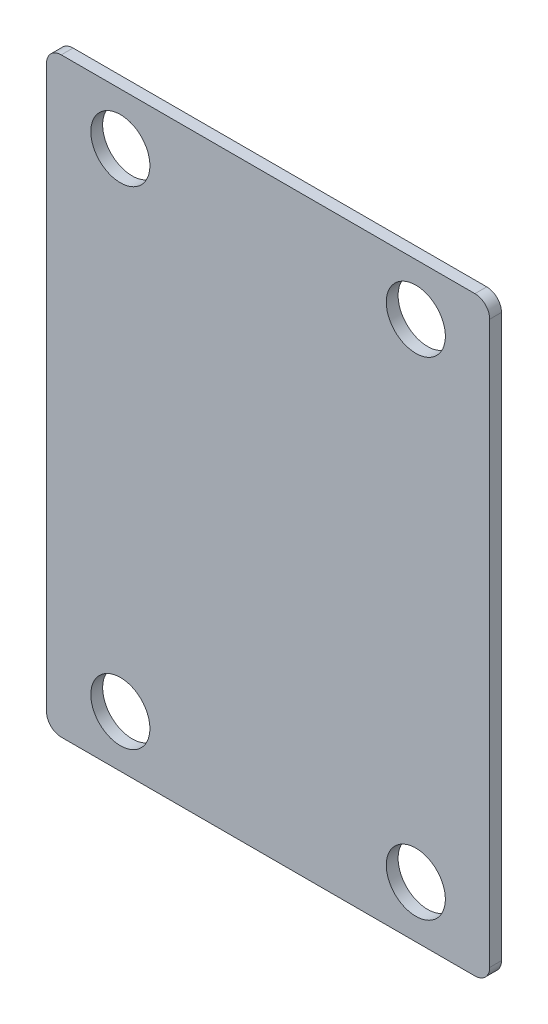
ISO-10303-21;
HEADER;
FILE_DESCRIPTION(('STEP AP214'),'2;1');
FILE_NAME('part.step','',(''),(''),'','','');
FILE_SCHEMA(('AUTOMOTIVE_DESIGN { 1 0 10303 214 1 1 1 1 }'));
ENDSEC;
DATA;
#1=APPLICATION_CONTEXT('core data for automotive mechanical design processes');
#2=APPLICATION_PROTOCOL_DEFINITION('international standard','automotive_design',2000,#1);
#3=PRODUCT_CONTEXT('',#1,'mechanical');
#4=PRODUCT('Part','Part','',(#3));
#5=PRODUCT_RELATED_PRODUCT_CATEGORY('part','',(#4));
#6=PRODUCT_DEFINITION_FORMATION('','',#4);
#7=PRODUCT_DEFINITION_CONTEXT('part definition',#1,'design');
#8=PRODUCT_DEFINITION('design','',#6,#7);
#9=PRODUCT_DEFINITION_SHAPE('','',#8);
#10=(LENGTH_UNIT() NAMED_UNIT(*) SI_UNIT(.MILLI.,.METRE.));
#11=(NAMED_UNIT(*) PLANE_ANGLE_UNIT() SI_UNIT($,.RADIAN.));
#12=(NAMED_UNIT(*) SI_UNIT($,.STERADIAN.) SOLID_ANGLE_UNIT());
#13=UNCERTAINTY_MEASURE_WITH_UNIT(LENGTH_MEASURE(1.E-05),#10,'distance_accuracy_value','');
#14=(GEOMETRIC_REPRESENTATION_CONTEXT(3) GLOBAL_UNCERTAINTY_ASSIGNED_CONTEXT((#13)) GLOBAL_UNIT_ASSIGNED_CONTEXT((#10,
#11,#12)) REPRESENTATION_CONTEXT('',''));
#15=CARTESIAN_POINT('',(0.,0.,0.));
#16=DIRECTION('',(0.,0.,1.));
#17=DIRECTION('',(1.,0.,0.));
#18=AXIS2_PLACEMENT_3D('',#15,#16,#17);
#19=CARTESIAN_POINT('',(0.,0.,1.6));
#20=DIRECTION('',(0.,0.,-1.));
#21=DIRECTION('',(-1.,0.,0.));
#22=AXIS2_PLACEMENT_3D('',#19,#20,#21);
#23=PLANE('',#22);
#24=DIRECTION('',(0.,-1.,0.));
#25=VECTOR('',#24,1.);
#26=CARTESIAN_POINT('',(-30.,-40.,1.6));
#27=LINE('',#26,#25);
#28=CARTESIAN_POINT('',(-30.,38.,1.6));
#29=VERTEX_POINT('',#28);
#30=CARTESIAN_POINT('',(-30.,-38.,1.6));
#31=VERTEX_POINT('',#30);
#32=EDGE_CURVE('E172',#29,#31,#27,.T.);
#33=ORIENTED_EDGE('',*,*,#32,.T.);
#34=CARTESIAN_POINT('',(-28.,-38.,1.6));
#35=DIRECTION('',(0.,0.,-1.));
#36=DIRECTION('',(-1.,0.,0.));
#37=AXIS2_PLACEMENT_3D('',#34,#35,#36);
#38=CIRCLE('',#37,2.);
#39=CARTESIAN_POINT('',(-28.,-40.,1.6));
#40=VERTEX_POINT('',#39);
#41=EDGE_CURVE('E149',#31,#40,#38,.F.);
#42=ORIENTED_EDGE('',*,*,#41,.T.);
#43=DIRECTION('',(1.,0.,0.));
#44=VECTOR('',#43,1.);
#45=CARTESIAN_POINT('',(-30.,-40.,1.6));
#46=LINE('',#45,#44);
#47=CARTESIAN_POINT('',(28.,-40.,1.6));
#48=VERTEX_POINT('',#47);
#49=EDGE_CURVE('E120',#40,#48,#46,.T.);
#50=ORIENTED_EDGE('',*,*,#49,.T.);
#51=CARTESIAN_POINT('',(28.,-38.,1.6));
#52=DIRECTION('',(0.,0.,-1.));
#53=DIRECTION('',(-1.,0.,0.));
#54=AXIS2_PLACEMENT_3D('',#51,#52,#53);
#55=CIRCLE('',#54,2.);
#56=CARTESIAN_POINT('',(30.,-38.,1.6));
#57=VERTEX_POINT('',#56);
#58=EDGE_CURVE('E145',#48,#57,#55,.F.);
#59=ORIENTED_EDGE('',*,*,#58,.T.);
#60=DIRECTION('',(0.,1.,0.));
#61=VECTOR('',#60,1.);
#62=CARTESIAN_POINT('',(30.,-40.,1.6));
#63=LINE('',#62,#61);
#64=CARTESIAN_POINT('',(30.,38.,1.6));
#65=VERTEX_POINT('',#64);
#66=EDGE_CURVE('E128',#57,#65,#63,.T.);
#67=ORIENTED_EDGE('',*,*,#66,.T.);
#68=CARTESIAN_POINT('',(28.,38.,1.6));
#69=DIRECTION('',(0.,0.,-1.));
#70=DIRECTION('',(-1.,0.,0.));
#71=AXIS2_PLACEMENT_3D('',#68,#69,#70);
#72=CIRCLE('',#71,2.);
#73=CARTESIAN_POINT('',(28.,40.,1.6));
#74=VERTEX_POINT('',#73);
#75=EDGE_CURVE('E55',#65,#74,#72,.F.);
#76=ORIENTED_EDGE('',*,*,#75,.T.);
#77=DIRECTION('',(-1.,0.,0.));
#78=VECTOR('',#77,1.);
#79=CARTESIAN_POINT('',(-30.,40.,1.6));
#80=LINE('',#79,#78);
#81=CARTESIAN_POINT('',(-28.,40.,1.6));
#82=VERTEX_POINT('',#81);
#83=EDGE_CURVE('E131',#74,#82,#80,.T.);
#84=ORIENTED_EDGE('',*,*,#83,.T.);
#85=CARTESIAN_POINT('',(-28.,38.,1.6));
#86=DIRECTION('',(0.,0.,-1.));
#87=DIRECTION('',(-1.,0.,0.));
#88=AXIS2_PLACEMENT_3D('',#85,#86,#87);
#89=CIRCLE('',#88,2.);
#90=EDGE_CURVE('E147',#82,#29,#89,.F.);
#91=ORIENTED_EDGE('',*,*,#90,.T.);
#92=EDGE_LOOP('',(#33,#42,#50,#59,#67,#76,#84,#91));
#93=FACE_BOUND('',#92,.T.);
#94=CARTESIAN_POINT('',(-20.,33.,1.6));
#95=DIRECTION('',(0.,0.,1.));
#96=DIRECTION('',(1.,0.,0.));
#97=AXIS2_PLACEMENT_3D('',#94,#95,#96);
#98=CIRCLE('',#97,4.);
#99=CARTESIAN_POINT('',(-16.,33.,1.6));
#100=VERTEX_POINT('',#99);
#101=EDGE_CURVE('E168',#100,#100,#98,.T.);
#102=ORIENTED_EDGE('',*,*,#101,.F.);
#103=EDGE_LOOP('',(#102));
#104=FACE_BOUND('',#103,.T.);
#105=CARTESIAN_POINT('',(20.,33.,1.6));
#106=DIRECTION('',(0.,0.,1.));
#107=DIRECTION('',(-1.,0.,0.));
#108=AXIS2_PLACEMENT_3D('',#105,#106,#107);
#109=CIRCLE('',#108,4.);
#110=CARTESIAN_POINT('',(16.,33.,1.6));
#111=VERTEX_POINT('',#110);
#112=EDGE_CURVE('E178',#111,#111,#109,.T.);
#113=ORIENTED_EDGE('',*,*,#112,.F.);
#114=EDGE_LOOP('',(#113));
#115=FACE_BOUND('',#114,.T.);
#116=CARTESIAN_POINT('',(20.,-33.,1.6));
#117=DIRECTION('',(0.,0.,1.));
#118=DIRECTION('',(1.,0.,0.));
#119=AXIS2_PLACEMENT_3D('',#116,#117,#118);
#120=CIRCLE('',#119,4.);
#121=CARTESIAN_POINT('',(24.,-33.,1.6));
#122=VERTEX_POINT('',#121);
#123=EDGE_CURVE('E184',#122,#122,#120,.T.);
#124=ORIENTED_EDGE('',*,*,#123,.F.);
#125=EDGE_LOOP('',(#124));
#126=FACE_BOUND('',#125,.T.);
#127=CARTESIAN_POINT('',(-20.,-33.,1.6));
#128=DIRECTION('',(0.,0.,1.));
#129=DIRECTION('',(-1.,0.,0.));
#130=AXIS2_PLACEMENT_3D('',#127,#128,#129);
#131=CIRCLE('',#130,4.);
#132=CARTESIAN_POINT('',(-24.,-33.,1.6));
#133=VERTEX_POINT('',#132);
#134=EDGE_CURVE('E190',#133,#133,#131,.T.);
#135=ORIENTED_EDGE('',*,*,#134,.F.);
#136=EDGE_LOOP('',(#135));
#137=FACE_BOUND('',#136,.T.);
#138=ADVANCED_FACE('F33',(#93,#104,#115,#126,#137),#23,.F.);
#139=CARTESIAN_POINT('',(0.,0.,0.));
#140=DIRECTION('',(0.,0.,-1.));
#141=DIRECTION('',(-1.,0.,0.));
#142=AXIS2_PLACEMENT_3D('',#139,#140,#141);
#143=PLANE('',#142);
#144=CARTESIAN_POINT('',(20.,-33.,0.));
#145=DIRECTION('',(0.,0.,1.));
#146=DIRECTION('',(1.,0.,0.));
#147=AXIS2_PLACEMENT_3D('',#144,#145,#146);
#148=CIRCLE('',#147,4.);
#149=CARTESIAN_POINT('',(24.,-33.,0.));
#150=VERTEX_POINT('',#149);
#151=EDGE_CURVE('E187',#150,#150,#148,.T.);
#152=ORIENTED_EDGE('',*,*,#151,.T.);
#153=EDGE_LOOP('',(#152));
#154=FACE_BOUND('',#153,.T.);
#155=CARTESIAN_POINT('',(-20.,33.,0.));
#156=DIRECTION('',(0.,0.,1.));
#157=DIRECTION('',(1.,0.,0.));
#158=AXIS2_PLACEMENT_3D('',#155,#156,#157);
#159=CIRCLE('',#158,4.);
#160=CARTESIAN_POINT('',(-16.,33.,0.));
#161=VERTEX_POINT('',#160);
#162=EDGE_CURVE('E175',#161,#161,#159,.T.);
#163=ORIENTED_EDGE('',*,*,#162,.T.);
#164=EDGE_LOOP('',(#163));
#165=FACE_BOUND('',#164,.T.);
#166=DIRECTION('',(1.,0.,0.));
#167=VECTOR('',#166,1.);
#168=CARTESIAN_POINT('',(-30.,-40.,0.));
#169=LINE('',#168,#167);
#170=CARTESIAN_POINT('',(-28.,-40.,0.));
#171=VERTEX_POINT('',#170);
#172=CARTESIAN_POINT('',(28.,-40.,0.));
#173=VERTEX_POINT('',#172);
#174=EDGE_CURVE('E117',#171,#173,#169,.T.);
#175=ORIENTED_EDGE('',*,*,#174,.F.);
#176=CARTESIAN_POINT('',(-28.,-38.,0.));
#177=DIRECTION('',(0.,0.,-1.));
#178=DIRECTION('',(-1.,0.,0.));
#179=AXIS2_PLACEMENT_3D('',#176,#177,#178);
#180=CIRCLE('',#179,2.);
#181=CARTESIAN_POINT('',(-30.,-38.,0.));
#182=VERTEX_POINT('',#181);
#183=EDGE_CURVE('E100',#171,#182,#180,.T.);
#184=ORIENTED_EDGE('',*,*,#183,.T.);
#185=DIRECTION('',(0.,-1.,0.));
#186=VECTOR('',#185,1.);
#187=CARTESIAN_POINT('',(-30.,-40.,0.));
#188=LINE('',#187,#186);
#189=CARTESIAN_POINT('',(-30.,38.,0.));
#190=VERTEX_POINT('',#189);
#191=EDGE_CURVE('E129',#190,#182,#188,.T.);
#192=ORIENTED_EDGE('',*,*,#191,.F.);
#193=CARTESIAN_POINT('',(-28.,38.,0.));
#194=DIRECTION('',(0.,0.,-1.));
#195=DIRECTION('',(-1.,0.,0.));
#196=AXIS2_PLACEMENT_3D('',#193,#194,#195);
#197=CIRCLE('',#196,2.);
#198=CARTESIAN_POINT('',(-28.,40.,0.));
#199=VERTEX_POINT('',#198);
#200=EDGE_CURVE('E111',#190,#199,#197,.T.);
#201=ORIENTED_EDGE('',*,*,#200,.T.);
#202=DIRECTION('',(-1.,0.,0.));
#203=VECTOR('',#202,1.);
#204=CARTESIAN_POINT('',(-30.,40.,0.));
#205=LINE('',#204,#203);
#206=CARTESIAN_POINT('',(28.,40.,0.));
#207=VERTEX_POINT('',#206);
#208=EDGE_CURVE('E133',#207,#199,#205,.T.);
#209=ORIENTED_EDGE('',*,*,#208,.F.);
#210=CARTESIAN_POINT('',(28.,38.,0.));
#211=DIRECTION('',(0.,0.,-1.));
#212=DIRECTION('',(-1.,0.,0.));
#213=AXIS2_PLACEMENT_3D('',#210,#211,#212);
#214=CIRCLE('',#213,2.);
#215=CARTESIAN_POINT('',(30.,38.,0.));
#216=VERTEX_POINT('',#215);
#217=EDGE_CURVE('E121',#207,#216,#214,.T.);
#218=ORIENTED_EDGE('',*,*,#217,.T.);
#219=DIRECTION('',(0.,1.,0.));
#220=VECTOR('',#219,1.);
#221=CARTESIAN_POINT('',(30.,-40.,0.));
#222=LINE('',#221,#220);
#223=CARTESIAN_POINT('',(30.,-38.,0.));
#224=VERTEX_POINT('',#223);
#225=EDGE_CURVE('E160',#224,#216,#222,.T.);
#226=ORIENTED_EDGE('',*,*,#225,.F.);
#227=CARTESIAN_POINT('',(28.,-38.,0.));
#228=DIRECTION('',(0.,0.,-1.));
#229=DIRECTION('',(-1.,0.,0.));
#230=AXIS2_PLACEMENT_3D('',#227,#228,#229);
#231=CIRCLE('',#230,2.);
#232=EDGE_CURVE('E127',#224,#173,#231,.T.);
#233=ORIENTED_EDGE('',*,*,#232,.T.);
#234=EDGE_LOOP('',(#175,#184,#192,#201,#209,#218,#226,#233));
#235=FACE_BOUND('',#234,.T.);
#236=CARTESIAN_POINT('',(20.,33.,0.));
#237=DIRECTION('',(0.,0.,1.));
#238=DIRECTION('',(-1.,0.,0.));
#239=AXIS2_PLACEMENT_3D('',#236,#237,#238);
#240=CIRCLE('',#239,4.);
#241=CARTESIAN_POINT('',(16.,33.,0.));
#242=VERTEX_POINT('',#241);
#243=EDGE_CURVE('E181',#242,#242,#240,.T.);
#244=ORIENTED_EDGE('',*,*,#243,.T.);
#245=EDGE_LOOP('',(#244));
#246=FACE_BOUND('',#245,.T.);
#247=CARTESIAN_POINT('',(-20.,-33.,0.));
#248=DIRECTION('',(0.,0.,1.));
#249=DIRECTION('',(-1.,0.,0.));
#250=AXIS2_PLACEMENT_3D('',#247,#248,#249);
#251=CIRCLE('',#250,4.);
#252=CARTESIAN_POINT('',(-24.,-33.,0.));
#253=VERTEX_POINT('',#252);
#254=EDGE_CURVE('E193',#253,#253,#251,.T.);
#255=ORIENTED_EDGE('',*,*,#254,.T.);
#256=EDGE_LOOP('',(#255));
#257=FACE_BOUND('',#256,.T.);
#258=ADVANCED_FACE('F124',(#154,#165,#235,#246,#257),#143,.T.);
#259=CARTESIAN_POINT('',(30.,-40.,1.6));
#260=DIRECTION('',(-1.,0.,0.));
#261=DIRECTION('',(0.,-1.,0.));
#262=AXIS2_PLACEMENT_3D('',#259,#260,#261);
#263=PLANE('',#262);
#264=ORIENTED_EDGE('',*,*,#66,.F.);
#265=DIRECTION('',(0.,0.,-1.));
#266=VECTOR('',#265,1.);
#267=CARTESIAN_POINT('',(30.,-38.,1.6));
#268=LINE('',#267,#266);
#269=EDGE_CURVE('E11',#57,#224,#268,.T.);
#270=ORIENTED_EDGE('',*,*,#269,.T.);
#271=ORIENTED_EDGE('',*,*,#225,.T.);
#272=DIRECTION('',(0.,0.,-1.));
#273=VECTOR('',#272,1.);
#274=CARTESIAN_POINT('',(30.,38.,1.6));
#275=LINE('',#274,#273);
#276=EDGE_CURVE('E41',#216,#65,#275,.F.);
#277=ORIENTED_EDGE('',*,*,#276,.T.);
#278=EDGE_LOOP('',(#264,#270,#271,#277));
#279=FACE_BOUND('',#278,.T.);
#280=ADVANCED_FACE('F158',(#279),#263,.F.);
#281=CARTESIAN_POINT('',(-30.,40.,1.6));
#282=DIRECTION('',(0.,-1.,0.));
#283=DIRECTION('',(1.,0.,0.));
#284=AXIS2_PLACEMENT_3D('',#281,#282,#283);
#285=PLANE('',#284);
#286=ORIENTED_EDGE('',*,*,#208,.T.);
#287=DIRECTION('',(0.,0.,-1.));
#288=VECTOR('',#287,1.);
#289=CARTESIAN_POINT('',(-28.,40.,1.6));
#290=LINE('',#289,#288);
#291=EDGE_CURVE('E48',#199,#82,#290,.F.);
#292=ORIENTED_EDGE('',*,*,#291,.T.);
#293=ORIENTED_EDGE('',*,*,#83,.F.);
#294=DIRECTION('',(0.,0.,-1.));
#295=VECTOR('',#294,1.);
#296=CARTESIAN_POINT('',(28.,40.,1.6));
#297=LINE('',#296,#295);
#298=EDGE_CURVE('E151',#74,#207,#297,.T.);
#299=ORIENTED_EDGE('',*,*,#298,.T.);
#300=EDGE_LOOP('',(#286,#292,#293,#299));
#301=FACE_BOUND('',#300,.T.);
#302=ADVANCED_FACE('F167',(#301),#285,.F.);
#303=CARTESIAN_POINT('',(-30.,-40.,1.6));
#304=DIRECTION('',(1.,0.,0.));
#305=DIRECTION('',(0.,1.,0.));
#306=AXIS2_PLACEMENT_3D('',#303,#304,#305);
#307=PLANE('',#306);
#308=ORIENTED_EDGE('',*,*,#191,.T.);
#309=DIRECTION('',(0.,0.,-1.));
#310=VECTOR('',#309,1.);
#311=CARTESIAN_POINT('',(-30.,-38.,1.6));
#312=LINE('',#311,#310);
#313=EDGE_CURVE('E105',#182,#31,#312,.F.);
#314=ORIENTED_EDGE('',*,*,#313,.T.);
#315=ORIENTED_EDGE('',*,*,#32,.F.);
#316=DIRECTION('',(0.,0.,-1.));
#317=VECTOR('',#316,1.);
#318=CARTESIAN_POINT('',(-30.,38.,1.6));
#319=LINE('',#318,#317);
#320=EDGE_CURVE('E110',#29,#190,#319,.T.);
#321=ORIENTED_EDGE('',*,*,#320,.T.);
#322=EDGE_LOOP('',(#308,#314,#315,#321));
#323=FACE_BOUND('',#322,.T.);
#324=ADVANCED_FACE('F215',(#323),#307,.F.);
#325=CARTESIAN_POINT('',(-30.,-40.,1.6));
#326=DIRECTION('',(0.,1.,0.));
#327=DIRECTION('',(-1.,0.,0.));
#328=AXIS2_PLACEMENT_3D('',#325,#326,#327);
#329=PLANE('',#328);
#330=ORIENTED_EDGE('',*,*,#49,.F.);
#331=DIRECTION('',(0.,0.,-1.));
#332=VECTOR('',#331,1.);
#333=CARTESIAN_POINT('',(-28.,-40.,1.6));
#334=LINE('',#333,#332);
#335=EDGE_CURVE('E104',#40,#171,#334,.T.);
#336=ORIENTED_EDGE('',*,*,#335,.T.);
#337=ORIENTED_EDGE('',*,*,#174,.T.);
#338=DIRECTION('',(0.,0.,-1.));
#339=VECTOR('',#338,1.);
#340=CARTESIAN_POINT('',(28.,-40.,1.6));
#341=LINE('',#340,#339);
#342=EDGE_CURVE('E122',#173,#48,#341,.F.);
#343=ORIENTED_EDGE('',*,*,#342,.T.);
#344=EDGE_LOOP('',(#330,#336,#337,#343));
#345=FACE_BOUND('',#344,.T.);
#346=ADVANCED_FACE('F116',(#345),#329,.F.);
#347=CARTESIAN_POINT('',(-20.,33.,1.6));
#348=DIRECTION('',(0.,0.,-1.));
#349=DIRECTION('',(-1.,0.,0.));
#350=AXIS2_PLACEMENT_3D('',#347,#348,#349);
#351=CYLINDRICAL_SURFACE('',#350,4.);
#352=ORIENTED_EDGE('',*,*,#101,.T.);
#353=EDGE_LOOP('',(#352));
#354=FACE_BOUND('',#353,.T.);
#355=ORIENTED_EDGE('',*,*,#162,.F.);
#356=EDGE_LOOP('',(#355));
#357=FACE_BOUND('',#356,.T.);
#358=ADVANCED_FACE('F210',(#354,#357),#351,.F.);
#359=CARTESIAN_POINT('',(20.,33.,1.6));
#360=DIRECTION('',(0.,0.,-1.));
#361=DIRECTION('',(-1.,0.,0.));
#362=AXIS2_PLACEMENT_3D('',#359,#360,#361);
#363=CYLINDRICAL_SURFACE('',#362,4.);
#364=ORIENTED_EDGE('',*,*,#112,.T.);
#365=EDGE_LOOP('',(#364));
#366=FACE_BOUND('',#365,.T.);
#367=ORIENTED_EDGE('',*,*,#243,.F.);
#368=EDGE_LOOP('',(#367));
#369=FACE_BOUND('',#368,.T.);
#370=ADVANCED_FACE('F309',(#366,#369),#363,.F.);
#371=CARTESIAN_POINT('',(20.,-33.,1.6));
#372=DIRECTION('',(0.,0.,-1.));
#373=DIRECTION('',(-1.,0.,0.));
#374=AXIS2_PLACEMENT_3D('',#371,#372,#373);
#375=CYLINDRICAL_SURFACE('',#374,4.);
#376=ORIENTED_EDGE('',*,*,#123,.T.);
#377=EDGE_LOOP('',(#376));
#378=FACE_BOUND('',#377,.T.);
#379=ORIENTED_EDGE('',*,*,#151,.F.);
#380=EDGE_LOOP('',(#379));
#381=FACE_BOUND('',#380,.T.);
#382=ADVANCED_FACE('F300',(#378,#381),#375,.F.);
#383=CARTESIAN_POINT('',(-20.,-33.,1.6));
#384=DIRECTION('',(0.,0.,-1.));
#385=DIRECTION('',(-1.,0.,0.));
#386=AXIS2_PLACEMENT_3D('',#383,#384,#385);
#387=CYLINDRICAL_SURFACE('',#386,4.);
#388=ORIENTED_EDGE('',*,*,#134,.T.);
#389=EDGE_LOOP('',(#388));
#390=FACE_BOUND('',#389,.T.);
#391=ORIENTED_EDGE('',*,*,#254,.F.);
#392=EDGE_LOOP('',(#391));
#393=FACE_BOUND('',#392,.T.);
#394=ADVANCED_FACE('F199',(#390,#393),#387,.F.);
#395=CARTESIAN_POINT('',(-28.,-38.,1.6));
#396=DIRECTION('',(0.,0.,-1.));
#397=DIRECTION('',(-1.,0.,0.));
#398=AXIS2_PLACEMENT_3D('',#395,#396,#397);
#399=CYLINDRICAL_SURFACE('',#398,2.);
#400=ORIENTED_EDGE('',*,*,#41,.F.);
#401=ORIENTED_EDGE('',*,*,#313,.F.);
#402=ORIENTED_EDGE('',*,*,#183,.F.);
#403=ORIENTED_EDGE('',*,*,#335,.F.);
#404=EDGE_LOOP('',(#400,#401,#402,#403));
#405=FACE_BOUND('',#404,.T.);
#406=ADVANCED_FACE('F103',(#405),#399,.T.);
#407=CARTESIAN_POINT('',(-28.,38.,1.6));
#408=DIRECTION('',(0.,0.,-1.));
#409=DIRECTION('',(-1.,0.,0.));
#410=AXIS2_PLACEMENT_3D('',#407,#408,#409);
#411=CYLINDRICAL_SURFACE('',#410,2.);
#412=ORIENTED_EDGE('',*,*,#90,.F.);
#413=ORIENTED_EDGE('',*,*,#291,.F.);
#414=ORIENTED_EDGE('',*,*,#200,.F.);
#415=ORIENTED_EDGE('',*,*,#320,.F.);
#416=EDGE_LOOP('',(#412,#413,#414,#415));
#417=FACE_BOUND('',#416,.T.);
#418=ADVANCED_FACE('F225',(#417),#411,.T.);
#419=CARTESIAN_POINT('',(28.,-38.,1.6));
#420=DIRECTION('',(0.,0.,-1.));
#421=DIRECTION('',(-1.,0.,0.));
#422=AXIS2_PLACEMENT_3D('',#419,#420,#421);
#423=CYLINDRICAL_SURFACE('',#422,2.);
#424=ORIENTED_EDGE('',*,*,#58,.F.);
#425=ORIENTED_EDGE('',*,*,#342,.F.);
#426=ORIENTED_EDGE('',*,*,#232,.F.);
#427=ORIENTED_EDGE('',*,*,#269,.F.);
#428=EDGE_LOOP('',(#424,#425,#426,#427));
#429=FACE_BOUND('',#428,.T.);
#430=ADVANCED_FACE('F227',(#429),#423,.T.);
#431=CARTESIAN_POINT('',(28.,38.,1.6));
#432=DIRECTION('',(0.,0.,-1.));
#433=DIRECTION('',(-1.,0.,0.));
#434=AXIS2_PLACEMENT_3D('',#431,#432,#433);
#435=CYLINDRICAL_SURFACE('',#434,2.);
#436=ORIENTED_EDGE('',*,*,#75,.F.);
#437=ORIENTED_EDGE('',*,*,#276,.F.);
#438=ORIENTED_EDGE('',*,*,#217,.F.);
#439=ORIENTED_EDGE('',*,*,#298,.F.);
#440=EDGE_LOOP('',(#436,#437,#438,#439));
#441=FACE_BOUND('',#440,.T.);
#442=ADVANCED_FACE('F35',(#441),#435,.T.);
#443=CLOSED_SHELL('',(#138,#258,#280,#302,#324,#346,#358,#370,#382,#394,#406,#418,#430,#442));
#444=MANIFOLD_SOLID_BREP('B2',#443);
#445=ADVANCED_BREP_SHAPE_REPRESENTATION('',(#18,#444),#14);
#446=SHAPE_DEFINITION_REPRESENTATION(#9,#445);
ENDSEC;
END-ISO-10303-21;
